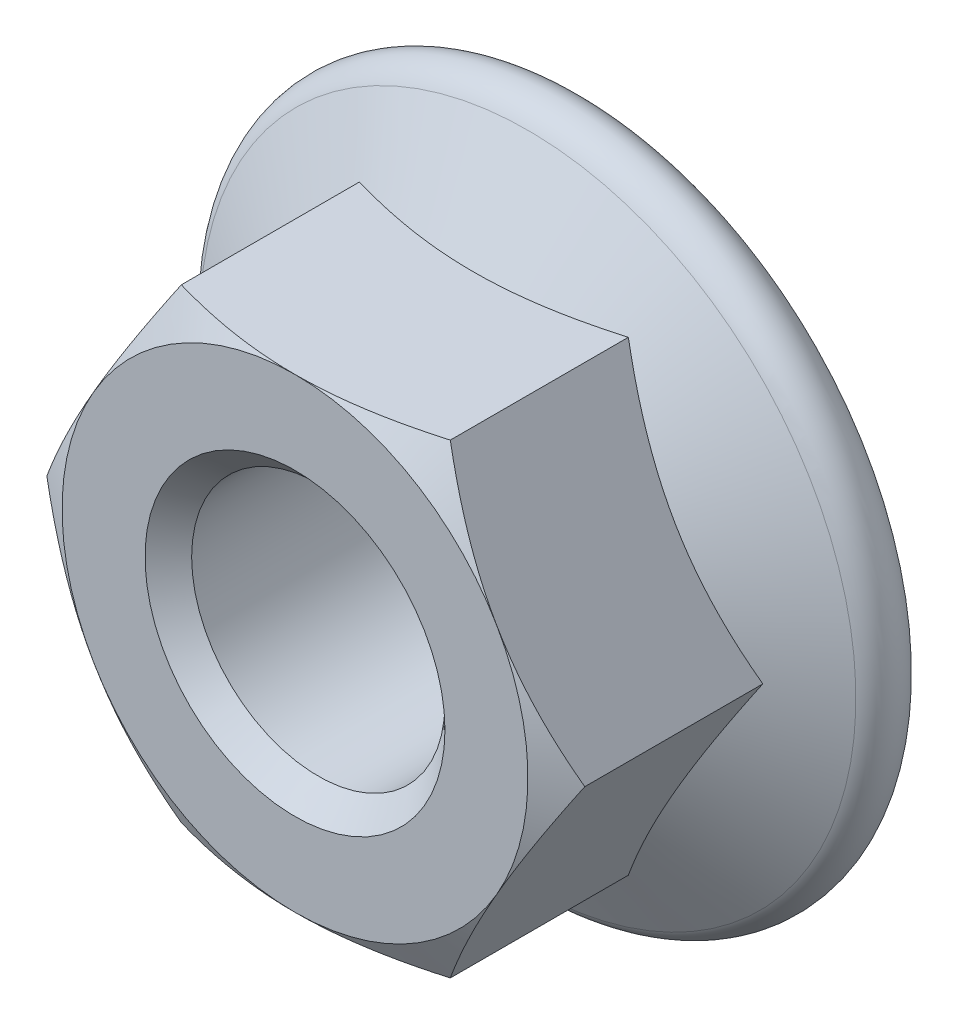
ISO-10303-21;
HEADER;
FILE_DESCRIPTION(('STEP AP214'),'2;1');
FILE_NAME('part.step','',(''),(''),'','','');
FILE_SCHEMA(('AUTOMOTIVE_DESIGN { 1 0 10303 214 1 1 1 1 }'));
ENDSEC;
DATA;
#1=APPLICATION_CONTEXT('core data for automotive mechanical design processes');
#2=APPLICATION_PROTOCOL_DEFINITION('international standard','automotive_design',2000,#1);
#3=PRODUCT_CONTEXT('',#1,'mechanical');
#4=PRODUCT('Part','Part','',(#3));
#5=PRODUCT_RELATED_PRODUCT_CATEGORY('part','',(#4));
#6=PRODUCT_DEFINITION_FORMATION('','',#4);
#7=PRODUCT_DEFINITION_CONTEXT('part definition',#1,'design');
#8=PRODUCT_DEFINITION('design','',#6,#7);
#9=PRODUCT_DEFINITION_SHAPE('','',#8);
#10=(LENGTH_UNIT() NAMED_UNIT(*) SI_UNIT(.MILLI.,.METRE.));
#11=(NAMED_UNIT(*) PLANE_ANGLE_UNIT() SI_UNIT($,.RADIAN.));
#12=(NAMED_UNIT(*) SI_UNIT($,.STERADIAN.) SOLID_ANGLE_UNIT());
#13=UNCERTAINTY_MEASURE_WITH_UNIT(LENGTH_MEASURE(1.E-05),#10,'distance_accuracy_value','');
#14=(GEOMETRIC_REPRESENTATION_CONTEXT(3) GLOBAL_UNCERTAINTY_ASSIGNED_CONTEXT((#13)) GLOBAL_UNIT_ASSIGNED_CONTEXT((#10,
#11,#12)) REPRESENTATION_CONTEXT('',''));
#15=CARTESIAN_POINT('',(0.,0.,0.));
#16=DIRECTION('',(0.,0.,1.));
#17=DIRECTION('',(1.,0.,0.));
#18=AXIS2_PLACEMENT_3D('',#15,#16,#17);
#19=CARTESIAN_POINT('',(116.671101853884,124.002196091981,109.));
#20=DIRECTION('',(0.,1.,0.));
#21=DIRECTION('',(0.,0.,1.));
#22=AXIS2_PLACEMENT_3D('',#19,#20,#21);
#23=PLANE('',#22);
#24=DIRECTION('',(0.,0.,-1.));
#25=VECTOR('',#24,1.);
#26=CARTESIAN_POINT('',(121.289904007401,124.002196091981,109.));
#27=LINE('',#26,#25);
#28=CARTESIAN_POINT('',(121.289904007401,124.002196091981,108.642734410092));
#29=VERTEX_POINT('',#28);
#30=CARTESIAN_POINT('',(121.289904007401,124.002196091981,105.584999383173));
#31=VERTEX_POINT('',#30);
#32=EDGE_CURVE('E105',#29,#31,#27,.T.);
#33=ORIENTED_EDGE('',*,*,#32,.T.);
#34=CARTESIAN_POINT('',(112.854569932878,124.002196091981,104.027645252341));
#35=CARTESIAN_POINT('',(113.028670295621,124.002196091981,104.111785230788));
#36=CARTESIAN_POINT('',(113.203178806788,124.002196091981,104.195095587076));
#37=CARTESIAN_POINT('',(113.553229544408,124.002196091981,104.359588717708));
#38=CARTESIAN_POINT('',(113.728771935977,124.002196091981,104.44077114027));
#39=CARTESIAN_POINT('',(114.082049776097,124.002196091981,104.600965101633));
#40=CARTESIAN_POINT('',(114.259792016124,124.002196091981,104.679961716444));
#41=CARTESIAN_POINT('',(114.616717949049,124.002196091981,104.834615947566));
#42=CARTESIAN_POINT('',(114.795901570879,124.002196091981,104.910273727319));
#43=CARTESIAN_POINT('',(115.161413375354,124.002196091981,105.059579129526));
#44=CARTESIAN_POINT('',(115.347794441612,124.002196091981,105.133098014597));
#45=CARTESIAN_POINT('',(115.722765359151,124.002196091981,105.274381754449));
#46=CARTESIAN_POINT('',(115.911355459512,124.002196091981,105.342145953117));
#47=CARTESIAN_POINT('',(116.290665881613,124.002196091981,105.470084829875));
#48=CARTESIAN_POINT('',(116.481380734726,124.002196091981,105.530275554097));
#49=CARTESIAN_POINT('',(116.865543999829,124.002196091981,105.641085533249));
#50=CARTESIAN_POINT('',(117.058991505555,124.002196091981,105.691707884917));
#51=CARTESIAN_POINT('',(117.447702345269,124.002196091981,105.78064451622));
#52=CARTESIAN_POINT('',(117.642951251657,124.002196091981,105.819020670594));
#53=CARTESIAN_POINT('',(118.035793074111,124.002196091981,105.881231941615));
#54=CARTESIAN_POINT('',(118.233385784783,124.002196091981,105.905068322957));
#55=CARTESIAN_POINT('',(118.627379808175,124.002196091981,105.935985315287));
#56=CARTESIAN_POINT('',(118.823764276613,124.002196091981,105.943275323691));
#57=CARTESIAN_POINT('',(119.216451654098,124.002196091981,105.941028226016));
#58=CARTESIAN_POINT('',(119.412754559926,124.002196091981,105.93149050934));
#59=CARTESIAN_POINT('',(119.748319206937,124.002196091981,105.901466050544));
#60=CARTESIAN_POINT('',(119.887947327311,124.002196091981,105.884858197205));
#61=CARTESIAN_POINT('',(120.166124240515,124.002196091981,105.844205230544));
#62=CARTESIAN_POINT('',(120.304672874304,124.002196091981,105.820159041801));
#63=CARTESIAN_POINT('',(120.718544005064,124.002196091981,105.738133045977));
#64=CARTESIAN_POINT('',(120.991928862072,124.002196091981,105.670282256499));
#65=CARTESIAN_POINT('',(121.400710224046,124.002196091981,105.553334559506));
#66=CARTESIAN_POINT('',(121.538241296952,124.002196091981,105.51128039321));
#67=CARTESIAN_POINT('',(121.81196591626,124.002196091981,105.422985620449));
#68=CARTESIAN_POINT('',(121.948159453563,124.002196091981,105.376744985525));
#69=CARTESIAN_POINT('',(122.219256711274,124.002196091981,105.2808043371));
#70=CARTESIAN_POINT('',(122.354160874402,124.002196091981,105.231105563357));
#71=CARTESIAN_POINT('',(122.622862718726,124.002196091981,105.128815301167));
#72=CARTESIAN_POINT('',(122.756660415051,124.002196091981,105.076223852345));
#73=CARTESIAN_POINT('',(123.082306374431,124.002196091981,104.944812731859));
#74=CARTESIAN_POINT('',(123.273627984409,124.002196091981,104.864690058126));
#75=CARTESIAN_POINT('',(123.654601117888,124.002196091981,104.700556506947));
#76=CARTESIAN_POINT('',(123.844252528889,124.002196091981,104.616545369933));
#77=CARTESIAN_POINT('',(124.222212218938,124.002196091981,104.445453979368));
#78=CARTESIAN_POINT('',(124.410520194685,124.002196091981,104.358373057585));
#79=CARTESIAN_POINT('',(124.785994503332,124.002196091981,104.181780053319));
#80=CARTESIAN_POINT('',(124.973160811041,124.002196091981,104.092267917425));
#81=CARTESIAN_POINT('',(125.533667395663,124.002196091981,103.820622470022));
#82=CARTESIAN_POINT('',(125.905593665019,124.002196091981,103.635573768498));
#83=CARTESIAN_POINT('',(126.646766116417,124.002196091981,103.260337429181));
#84=CARTESIAN_POINT('',(127.016012641722,124.002196091981,103.070150464859));
#85=CARTESIAN_POINT('',(127.720139106845,124.002196091981,102.703078877873));
#86=CARTESIAN_POINT('',(128.055178657492,124.002196091981,102.526499883192));
#87=CARTESIAN_POINT('',(128.724076813033,124.002196091981,102.17109182806));
#88=CARTESIAN_POINT('',(129.057935371963,124.002196091981,101.992262681241));
#89=CARTESIAN_POINT('',(129.723888929967,124.002196091981,101.633356362133));
#90=CARTESIAN_POINT('',(130.055986254079,124.002196091981,101.453283498695));
#91=CARTESIAN_POINT('',(130.719432454581,124.002196091981,101.091808101388));
#92=CARTESIAN_POINT('',(131.05078137217,124.002196091981,100.910405643166));
#93=CARTESIAN_POINT('',(131.381857785287,124.002196091981,100.72851063404));
#94=B_SPLINE_CURVE_WITH_KNOTS('',3,(#34,#35,#36,#37,#38,#39,#40,#41,#42,#43,#44,#45,#46,#47,#48,
#49,#50,#51,#52,#53,#54,#55,#56,#57,#58,#59,#60,#61,#62,#63,#64,#65,#66,#67,#68,#69,#70,#71,#72,
#73,#74,#75,#76,#77,#78,#79,#80,#81,#82,#83,#84,#85,#86,#87,#88,#89,#90,#91,#92,#93),
.UNSPECIFIED.,.F.,.F.,(4,2,2,2,2,2,2,2,2,2,2,2,2,2,2,2,2,2,2,2,2,2,2,2,2,2,2,2,2,4),(0.,
0.580105967146605,1.16030723812042,1.74379921729656,2.32726260193295,2.92826021724387,
3.52932626266778,4.12909656482218,4.72867242187309,5.32516906985851,5.92161382615311,
6.51046734710153,7.09934223513768,7.52097336353687,7.94266547917407,8.7865385967925,
9.21795564245651,9.64937562087386,10.0806417223477,10.5119019176761,11.134106170094,
11.7563520167808,12.3787341607446,13.0011299889885,14.2473133572912,15.4933341741928,
16.6294938464963,17.7656972617079,18.8990225578083,20.0322838661054),.UNSPECIFIED.);
#95=CARTESIAN_POINT('',(116.671101853884,124.002196091981,105.584999383173));
#96=VERTEX_POINT('',#95);
#97=EDGE_CURVE('E89',#31,#96,#94,.F.);
#98=ORIENTED_EDGE('',*,*,#97,.T.);
#99=DIRECTION('',(0.,0.,-1.));
#100=VECTOR('',#99,1.);
#101=CARTESIAN_POINT('',(116.671101853884,124.002196091981,109.));
#102=LINE('',#101,#100);
#103=CARTESIAN_POINT('',(116.671101853884,124.002196091981,108.642734410092));
#104=VERTEX_POINT('',#103);
#105=EDGE_CURVE('E102',#104,#96,#102,.T.);
#106=ORIENTED_EDGE('',*,*,#105,.F.);
#107=CARTESIAN_POINT('',(112.744332002029,124.002196091981,107.03194747869));
#108=CARTESIAN_POINT('',(112.919372940089,124.002196091981,107.116989552009));
#109=CARTESIAN_POINT('',(113.09481230546,124.002196091981,107.201225429848));
#110=CARTESIAN_POINT('',(113.446699758567,124.002196091981,107.367631826773));
#111=CARTESIAN_POINT('',(113.623147997298,124.002196091981,107.449802026211));
#112=CARTESIAN_POINT('',(113.978157818879,124.002196091981,107.612030165374));
#113=CARTESIAN_POINT('',(114.156725656919,124.002196091981,107.692074463338));
#114=CARTESIAN_POINT('',(114.515270821508,124.002196091981,107.848929178528));
#115=CARTESIAN_POINT('',(114.695248081811,124.002196091981,107.925739746677));
#116=CARTESIAN_POINT('',(115.062715129453,124.002196091981,108.077679032264));
#117=CARTESIAN_POINT('',(115.250260406828,124.002196091981,108.152674270128));
#118=CARTESIAN_POINT('',(115.627532621469,124.002196091981,108.297067878412));
#119=CARTESIAN_POINT('',(115.817259798877,124.002196091981,108.3664656259));
#120=CARTESIAN_POINT('',(116.198853609428,124.002196091981,108.497867360485));
#121=CARTESIAN_POINT('',(116.390715145105,124.002196091981,108.559886003728));
#122=CARTESIAN_POINT('',(116.777189615399,124.002196091981,108.674561711557));
#123=CARTESIAN_POINT('',(116.971801673979,124.002196091981,108.727221687423));
#124=CARTESIAN_POINT('',(117.362860739232,124.002196091981,108.820408167018));
#125=CARTESIAN_POINT('',(117.559292346354,124.002196091981,108.860998113875));
#126=CARTESIAN_POINT('',(117.95463123238,124.002196091981,108.927751877519));
#127=CARTESIAN_POINT('',(118.153538246257,124.002196091981,108.953917225317));
#128=CARTESIAN_POINT('',(118.550223715742,124.002196091981,108.989393720221));
#129=CARTESIAN_POINT('',(118.747982066445,124.002196091981,108.998924128112));
#130=CARTESIAN_POINT('',(119.143605068304,124.002196091981,109.000901985867));
#131=CARTESIAN_POINT('',(119.341469722713,124.002196091981,108.993348879088));
#132=CARTESIAN_POINT('',(119.67632087156,124.002196091981,108.966647938879));
#133=CARTESIAN_POINT('',(119.81366221538,124.002196091981,108.951686258671));
#134=CARTESIAN_POINT('',(120.087355743056,124.002196091981,108.914444823405));
#135=CARTESIAN_POINT('',(120.223707794711,124.002196091981,108.892164108058));
#136=CARTESIAN_POINT('',(120.631080396758,124.002196091981,108.815513146701));
#137=CARTESIAN_POINT('',(120.900279088005,124.002196091981,108.751346591712));
#138=CARTESIAN_POINT('',(121.303039656072,124.002196091981,108.639829230765));
#139=CARTESIAN_POINT('',(121.438679573053,124.002196091981,108.599554903281));
#140=CARTESIAN_POINT('',(121.708641229049,124.002196091981,108.514768387074));
#141=CARTESIAN_POINT('',(121.842962957571,124.002196091981,108.470256164648));
#142=CARTESIAN_POINT('',(122.110333142538,124.002196091981,108.377712937832));
#143=CARTESIAN_POINT('',(122.243381963081,124.002196091981,108.329682975866));
#144=CARTESIAN_POINT('',(122.508370417183,124.002196091981,108.230674980172));
#145=CARTESIAN_POINT('',(122.640310080666,124.002196091981,108.179697026272));
#146=CARTESIAN_POINT('',(123.014291705351,124.002196091981,108.031171990599));
#147=CARTESIAN_POINT('',(123.255160836971,124.002196091981,107.930673898552));
#148=CARTESIAN_POINT('',(123.734293857578,124.002196091981,107.723625680052));
#149=CARTESIAN_POINT('',(123.972557404172,124.002196091981,107.617074769343));
#150=CARTESIAN_POINT('',(124.447127597305,124.002196091981,107.399447696146));
#151=CARTESIAN_POINT('',(124.683433343807,124.002196091981,107.288369577758));
#152=CARTESIAN_POINT('',(125.154409492305,124.002196091981,107.062840090155));
#153=CARTESIAN_POINT('',(125.389079973455,124.002196091981,106.948388885636));
#154=CARTESIAN_POINT('',(125.857541023468,124.002196091981,106.716688354032));
#155=CARTESIAN_POINT('',(126.091329351251,124.002196091981,106.59943450537));
#156=CARTESIAN_POINT('',(126.557870998159,124.002196091981,106.362883517059));
#157=CARTESIAN_POINT('',(126.790624306773,124.002196091981,106.243586356721));
#158=CARTESIAN_POINT('',(127.487519576127,124.002196091981,105.883345960568));
#159=CARTESIAN_POINT('',(127.950415903306,124.002196091981,105.639994355233));
#160=CARTESIAN_POINT('',(128.821123220575,124.002196091981,105.177174281006));
#161=CARTESIAN_POINT('',(129.22917642717,124.002196091981,104.958159321678));
#162=CARTESIAN_POINT('',(130.044016938461,124.002196091981,104.517719054942));
#163=CARTESIAN_POINT('',(130.450804150931,124.002196091981,104.29629357698));
#164=CARTESIAN_POINT('',(131.261989589027,124.002196091981,103.852454124858));
#165=CARTESIAN_POINT('',(131.666391193919,124.002196091981,103.630046317593));
#166=CARTESIAN_POINT('',(132.4744076827,124.002196091981,103.183887785711));
#167=CARTESIAN_POINT('',(132.878022631464,124.002196091981,102.960137178634));
#168=CARTESIAN_POINT('',(133.281366269009,124.002196091981,102.735901359167));
#169=B_SPLINE_CURVE_WITH_KNOTS('',3,(#107,#108,#109,#110,#111,#112,#113,#114,#115,#116,#117,
#118,#119,#120,#121,#122,#123,#124,#125,#126,#127,#128,#129,#130,#131,#132,#133,#134,#135,#136,
#137,#138,#139,#140,#141,#142,#143,#144,#145,#146,#147,#148,#149,#150,#151,#152,#153,#154,#155,
#156,#157,#158,#159,#160,#161,#162,#163,#164,#165,#166,#167,#168),.UNSPECIFIED.,.F.,.F.,(4,2,2,
2,2,2,2,2,2,2,2,2,2,2,2,2,2,2,2,2,2,2,2,2,2,2,2,2,2,2,4),(0.,0.583824901486328,1.16773959630481,
1.75477613722881,2.34178524980504,2.94766803009382,3.55361814489943,4.15834390654722,
4.76288122048036,5.36418236246308,5.96541967072356,6.55867063215254,7.15194092410998,
7.56620252172204,7.98051849399418,8.80956515672429,9.23400657522244,9.65845136947785,
10.0827708916112,10.5070789290598,11.2899312161693,12.0728851687987,12.8561810448207,
13.6394387383186,14.4240590899562,15.2086873911361,16.7775448955027,18.1668801950531,
19.556314443557,20.9408885757902,22.3253432306253),.UNSPECIFIED.);
#170=CARTESIAN_POINT('',(118.980502930643,124.002196091981,109.));
#171=VERTEX_POINT('',#170);
#172=EDGE_CURVE('E161',#171,#104,#169,.F.);
#173=ORIENTED_EDGE('',*,*,#172,.F.);
#174=EDGE_CURVE('E239',#29,#171,#169,.F.);
#175=ORIENTED_EDGE('',*,*,#174,.F.);
#176=EDGE_LOOP('',(#33,#98,#106,#173,#175));
#177=FACE_BOUND('',#176,.T.);
#178=ADVANCED_FACE('F17',(#177),#23,.T.);
#179=CARTESIAN_POINT('',(121.289904007401,124.002196091981,109.));
#180=DIRECTION('',(0.866025403784439,0.5,0.));
#181=DIRECTION('',(-0.5,0.866025403784439,0.));
#182=AXIS2_PLACEMENT_3D('',#179,#180,#181);
#183=PLANE('',#182);
#184=DIRECTION('',(0.,0.,-1.));
#185=VECTOR('',#184,1.);
#186=CARTESIAN_POINT('',(123.59930508416,120.002196091981,109.));
#187=LINE('',#186,#185);
#188=CARTESIAN_POINT('',(123.59930508416,120.002196091981,108.642734410092));
#189=VERTEX_POINT('',#188);
#190=CARTESIAN_POINT('',(123.59930508416,120.002196091981,105.584999383173));
#191=VERTEX_POINT('',#190);
#192=EDGE_CURVE('E236',#189,#191,#187,.T.);
#193=ORIENTED_EDGE('',*,*,#192,.T.);
#194=CARTESIAN_POINT('',(123.599420554214,120.001996091981,105.584932714006));
#195=CARTESIAN_POINT('',(123.497934414457,120.177775242304,105.643547099433));
#196=CARTESIAN_POINT('',(123.395572252083,120.355071708307,105.696854651619));
#197=CARTESIAN_POINT('',(123.18907543612,120.712734685156,105.789903302335));
#198=CARTESIAN_POINT('',(123.084937113499,120.893107550951,105.829611484051));
#199=CARTESIAN_POINT('',(122.8779510608,121.251617910683,105.891422757801));
#200=CARTESIAN_POINT('',(122.775135177193,121.429700244916,105.913937241558));
#201=CARTESIAN_POINT('',(122.569019650633,121.786702809147,105.940814349934));
#202=CARTESIAN_POINT('',(122.465720756804,121.965621741625,105.945199231654));
#203=CARTESIAN_POINT('',(122.272702635689,122.299938934177,105.936074900141));
#204=CARTESIAN_POINT('',(122.182954507568,122.455387251968,105.924806019093));
#205=CARTESIAN_POINT('',(122.004042956998,122.765271147616,105.889090982283));
#206=CARTESIAN_POINT('',(121.914880153324,122.919705653725,105.86463262737));
#207=CARTESIAN_POINT('',(121.735599750766,123.230228419755,105.803488908162));
#208=CARTESIAN_POINT('',(121.645504841537,123.386277380044,105.766544369426));
#209=CARTESIAN_POINT('',(121.466658732643,123.696047927384,105.682694900533));
#210=CARTESIAN_POINT('',(121.377905241869,123.849773482754,105.635809670868));
#211=CARTESIAN_POINT('',(121.289788537348,124.002396091981,105.584932714006));
#212=B_SPLINE_CURVE_WITH_KNOTS('',3,(#194,#195,#196,#197,#198,#199,#200,#201,#202,#203,#204,
#205,#206,#207,#208,#209,#210,#211),.UNSPECIFIED.,.F.,.F.,(4,2,2,2,2,2,2,2,4),(0.,
0.634047835695967,1.26961969224542,1.8894615721312,2.50854226669297,3.04757825393388,
3.58711366126907,4.13861653143768,4.68903648037747),.UNSPECIFIED.);
#213=EDGE_CURVE('E107',#191,#31,#212,.T.);
#214=ORIENTED_EDGE('',*,*,#213,.T.);
#215=ORIENTED_EDGE('',*,*,#32,.F.);
#216=CARTESIAN_POINT('',(123.599420554214,120.001996091981,108.642667740925));
#217=CARTESIAN_POINT('',(123.497934414457,120.177775242304,108.701282126352));
#218=CARTESIAN_POINT('',(123.395572252083,120.355071708307,108.754589678538));
#219=CARTESIAN_POINT('',(123.18907543612,120.712734685156,108.847638329254));
#220=CARTESIAN_POINT('',(123.084937113499,120.893107550951,108.88734651097));
#221=CARTESIAN_POINT('',(122.8779510608,121.251617910683,108.94915778472));
#222=CARTESIAN_POINT('',(122.775135177193,121.429700244916,108.971672268477));
#223=CARTESIAN_POINT('',(122.569019650633,121.786702809147,108.998549376853));
#224=CARTESIAN_POINT('',(122.465720756804,121.965621741625,109.002934258573));
#225=CARTESIAN_POINT('',(122.272702635689,122.299938934177,108.99380992706));
#226=CARTESIAN_POINT('',(122.182954507568,122.455387251968,108.982541046012));
#227=CARTESIAN_POINT('',(122.004042956998,122.765271147616,108.946826009202));
#228=CARTESIAN_POINT('',(121.914880153324,122.919705653725,108.922367654289));
#229=CARTESIAN_POINT('',(121.735599750766,123.230228419755,108.861223935081));
#230=CARTESIAN_POINT('',(121.645504841537,123.386277380044,108.824279396345));
#231=CARTESIAN_POINT('',(121.466658732643,123.696047927384,108.740429927452));
#232=CARTESIAN_POINT('',(121.377905241869,123.849773482754,108.693544697787));
#233=CARTESIAN_POINT('',(121.289788537348,124.002396091981,108.642667740925));
#234=B_SPLINE_CURVE_WITH_KNOTS('',3,(#216,#217,#218,#219,#220,#221,#222,#223,#224,#225,#226,
#227,#228,#229,#230,#231,#232,#233),.UNSPECIFIED.,.F.,.F.,(4,2,2,2,2,2,2,2,4),(0.,
0.634047835695971,1.2696196922454,1.88946157213121,2.50854226669297,3.04757825393388,
3.58711366126907,4.13861653143768,4.68903648037748),.UNSPECIFIED.);
#235=CARTESIAN_POINT('',(122.444604545781,122.002196091981,109.));
#236=VERTEX_POINT('',#235);
#237=EDGE_CURVE('E173',#236,#29,#234,.T.);
#238=ORIENTED_EDGE('',*,*,#237,.F.);
#239=EDGE_CURVE('E178',#189,#236,#234,.T.);
#240=ORIENTED_EDGE('',*,*,#239,.F.);
#241=EDGE_LOOP('',(#193,#214,#215,#238,#240));
#242=FACE_BOUND('',#241,.T.);
#243=ADVANCED_FACE('F183',(#242),#183,.T.);
#244=CARTESIAN_POINT('',(123.59930508416,120.002196091981,109.));
#245=DIRECTION('',(0.866025403784438,-0.5,0.));
#246=DIRECTION('',(0.5,0.866025403784438,0.));
#247=AXIS2_PLACEMENT_3D('',#244,#245,#246);
#248=PLANE('',#247);
#249=DIRECTION('',(0.,0.,-1.));
#250=VECTOR('',#249,1.);
#251=CARTESIAN_POINT('',(121.289904007401,116.002196091981,109.));
#252=LINE('',#251,#250);
#253=CARTESIAN_POINT('',(121.289904007401,116.002196091981,108.642734410092));
#254=VERTEX_POINT('',#253);
#255=CARTESIAN_POINT('',(121.289904007401,116.002196091981,105.584999383173));
#256=VERTEX_POINT('',#255);
#257=EDGE_CURVE('E410',#254,#256,#252,.T.);
#258=ORIENTED_EDGE('',*,*,#257,.T.);
#259=CARTESIAN_POINT('',(121.289788537348,116.001996091981,105.584932714006));
#260=CARTESIAN_POINT('',(121.391274677105,116.177775242304,105.643547099433));
#261=CARTESIAN_POINT('',(121.493636839478,116.355071708307,105.696854651619));
#262=CARTESIAN_POINT('',(121.700133655441,116.712734685156,105.789903302335));
#263=CARTESIAN_POINT('',(121.804271978062,116.893107550951,105.829611484051));
#264=CARTESIAN_POINT('',(122.011258030761,117.251617910683,105.891422757801));
#265=CARTESIAN_POINT('',(122.114073914368,117.429700244916,105.913937241558));
#266=CARTESIAN_POINT('',(122.320189440928,117.786702809147,105.940814349934));
#267=CARTESIAN_POINT('',(122.423488334757,117.965621741625,105.945199231654));
#268=CARTESIAN_POINT('',(122.616506455872,118.299938934177,105.936074900141));
#269=CARTESIAN_POINT('',(122.706254583994,118.455387251968,105.924806019093));
#270=CARTESIAN_POINT('',(122.885166134564,118.765271147616,105.889090982283));
#271=CARTESIAN_POINT('',(122.974328938238,118.919705653725,105.864632627369));
#272=CARTESIAN_POINT('',(123.153609340795,119.230228419755,105.803488908162));
#273=CARTESIAN_POINT('',(123.243704250024,119.386277380044,105.766544369426));
#274=CARTESIAN_POINT('',(123.422550358918,119.696047927384,105.682694900533));
#275=CARTESIAN_POINT('',(123.511303849693,119.849773482754,105.635809670868));
#276=CARTESIAN_POINT('',(123.599420554214,120.002396091981,105.584932714006));
#277=B_SPLINE_CURVE_WITH_KNOTS('',3,(#259,#260,#261,#262,#263,#264,#265,#266,#267,#268,#269,
#270,#271,#272,#273,#274,#275,#276),.UNSPECIFIED.,.F.,.F.,(4,2,2,2,2,2,2,2,4),(0.,
0.634047835696002,1.26961969224548,1.8894615721313,2.50854226669307,3.04757825393394,
3.58711366126911,4.13861653143769,4.68903648037745),.UNSPECIFIED.);
#278=EDGE_CURVE('E196',#256,#191,#277,.T.);
#279=ORIENTED_EDGE('',*,*,#278,.T.);
#280=ORIENTED_EDGE('',*,*,#192,.F.);
#281=CARTESIAN_POINT('',(121.289788537348,116.001996091981,108.642667740925));
#282=CARTESIAN_POINT('',(121.391274677105,116.177775242304,108.701282126352));
#283=CARTESIAN_POINT('',(121.493636839478,116.355071708307,108.754589678538));
#284=CARTESIAN_POINT('',(121.700133655441,116.712734685156,108.847638329254));
#285=CARTESIAN_POINT('',(121.804271978062,116.893107550951,108.88734651097));
#286=CARTESIAN_POINT('',(122.011258030761,117.251617910683,108.94915778472));
#287=CARTESIAN_POINT('',(122.114073914368,117.429700244916,108.971672268477));
#288=CARTESIAN_POINT('',(122.320189440928,117.786702809147,108.998549376853));
#289=CARTESIAN_POINT('',(122.423488334757,117.965621741625,109.002934258573));
#290=CARTESIAN_POINT('',(122.616506455872,118.299938934177,108.99380992706));
#291=CARTESIAN_POINT('',(122.706254583994,118.455387251968,108.982541046012));
#292=CARTESIAN_POINT('',(122.885166134564,118.765271147616,108.946826009202));
#293=CARTESIAN_POINT('',(122.974328938238,118.919705653725,108.922367654288));
#294=CARTESIAN_POINT('',(123.153609340795,119.230228419755,108.861223935081));
#295=CARTESIAN_POINT('',(123.243704250024,119.386277380044,108.824279396345));
#296=CARTESIAN_POINT('',(123.422550358918,119.696047927384,108.740429927452));
#297=CARTESIAN_POINT('',(123.511303849693,119.849773482754,108.693544697787));
#298=CARTESIAN_POINT('',(123.599420554214,120.002396091981,108.642667740925));
#299=B_SPLINE_CURVE_WITH_KNOTS('',3,(#281,#282,#283,#284,#285,#286,#287,#288,#289,#290,#291,
#292,#293,#294,#295,#296,#297,#298),.UNSPECIFIED.,.F.,.F.,(4,2,2,2,2,2,2,2,4),(0.,
0.634047835695994,1.26961969224548,1.88946157213129,2.50854226669307,3.04757825393395,
3.58711366126911,4.13861653143768,4.68903648037746),.UNSPECIFIED.);
#300=CARTESIAN_POINT('',(122.444604545781,118.002196091981,109.));
#301=VERTEX_POINT('',#300);
#302=EDGE_CURVE('E118',#301,#189,#299,.T.);
#303=ORIENTED_EDGE('',*,*,#302,.F.);
#304=EDGE_CURVE('E113',#254,#301,#299,.T.);
#305=ORIENTED_EDGE('',*,*,#304,.F.);
#306=EDGE_LOOP('',(#258,#279,#280,#303,#305));
#307=FACE_BOUND('',#306,.T.);
#308=ADVANCED_FACE('F186',(#307),#248,.T.);
#309=CARTESIAN_POINT('',(121.289904007401,116.002196091981,109.));
#310=DIRECTION('',(0.,-1.,0.));
#311=DIRECTION('',(0.,0.,-1.));
#312=AXIS2_PLACEMENT_3D('',#309,#310,#311);
#313=PLANE('',#312);
#314=DIRECTION('',(0.,0.,-1.));
#315=VECTOR('',#314,1.);
#316=CARTESIAN_POINT('',(116.671101853884,116.002196091981,109.));
#317=LINE('',#316,#315);
#318=CARTESIAN_POINT('',(116.671101853884,116.002196091981,108.642734410092));
#319=VERTEX_POINT('',#318);
#320=CARTESIAN_POINT('',(116.671101853884,116.002196091981,105.584999383173));
#321=VERTEX_POINT('',#320);
#322=EDGE_CURVE('E115',#319,#321,#317,.T.);
#323=ORIENTED_EDGE('',*,*,#322,.T.);
#324=CARTESIAN_POINT('',(112.854569932878,116.002196091981,104.027645252341));
#325=CARTESIAN_POINT('',(113.028670295621,116.002196091981,104.111785230788));
#326=CARTESIAN_POINT('',(113.203178806788,116.002196091981,104.195095587076));
#327=CARTESIAN_POINT('',(113.553229544408,116.002196091981,104.359588717708));
#328=CARTESIAN_POINT('',(113.728771935977,116.002196091981,104.44077114027));
#329=CARTESIAN_POINT('',(114.082049776097,116.002196091981,104.600965101633));
#330=CARTESIAN_POINT('',(114.259792016124,116.002196091981,104.679961716444));
#331=CARTESIAN_POINT('',(114.616717949049,116.002196091981,104.834615947566));
#332=CARTESIAN_POINT('',(114.795901570879,116.002196091981,104.910273727319));
#333=CARTESIAN_POINT('',(115.161413375354,116.002196091981,105.059579129526));
#334=CARTESIAN_POINT('',(115.347794441612,116.002196091981,105.133098014597));
#335=CARTESIAN_POINT('',(115.722765359151,116.002196091981,105.274381754449));
#336=CARTESIAN_POINT('',(115.911355459512,116.002196091981,105.342145953117));
#337=CARTESIAN_POINT('',(116.290665881613,116.002196091981,105.470084829875));
#338=CARTESIAN_POINT('',(116.481380734726,116.002196091981,105.530275554097));
#339=CARTESIAN_POINT('',(116.865543999829,116.002196091981,105.641085533249));
#340=CARTESIAN_POINT('',(117.058991505555,116.002196091981,105.691707884917));
#341=CARTESIAN_POINT('',(117.447702345269,116.002196091981,105.78064451622));
#342=CARTESIAN_POINT('',(117.642951251657,116.002196091981,105.819020670594));
#343=CARTESIAN_POINT('',(118.035793074111,116.002196091981,105.881231941615));
#344=CARTESIAN_POINT('',(118.233385784783,116.002196091981,105.905068322957));
#345=CARTESIAN_POINT('',(118.627379808175,116.002196091981,105.935985315287));
#346=CARTESIAN_POINT('',(118.823764276613,116.002196091981,105.943275323691));
#347=CARTESIAN_POINT('',(119.216451654098,116.002196091981,105.941028226016));
#348=CARTESIAN_POINT('',(119.412754559926,116.002196091981,105.93149050934));
#349=CARTESIAN_POINT('',(119.748319206937,116.002196091981,105.901466050544));
#350=CARTESIAN_POINT('',(119.887947327311,116.002196091981,105.884858197205));
#351=CARTESIAN_POINT('',(120.166124240515,116.002196091981,105.844205230544));
#352=CARTESIAN_POINT('',(120.304672874304,116.002196091981,105.820159041801));
#353=CARTESIAN_POINT('',(120.718544005064,116.002196091981,105.738133045977));
#354=CARTESIAN_POINT('',(120.991928862072,116.002196091981,105.670282256499));
#355=CARTESIAN_POINT('',(121.400710224046,116.002196091981,105.553334559506));
#356=CARTESIAN_POINT('',(121.538241296952,116.002196091981,105.51128039321));
#357=CARTESIAN_POINT('',(121.81196591626,116.002196091981,105.422985620449));
#358=CARTESIAN_POINT('',(121.948159453563,116.002196091981,105.376744985525));
#359=CARTESIAN_POINT('',(122.219256711274,116.002196091981,105.2808043371));
#360=CARTESIAN_POINT('',(122.354160874402,116.002196091981,105.231105563357));
#361=CARTESIAN_POINT('',(122.622862718726,116.002196091981,105.128815301167));
#362=CARTESIAN_POINT('',(122.756660415051,116.002196091981,105.076223852345));
#363=CARTESIAN_POINT('',(123.082306374431,116.002196091981,104.944812731859));
#364=CARTESIAN_POINT('',(123.273627984409,116.002196091981,104.864690058126));
#365=CARTESIAN_POINT('',(123.654601117888,116.002196091981,104.700556506947));
#366=CARTESIAN_POINT('',(123.844252528889,116.002196091981,104.616545369933));
#367=CARTESIAN_POINT('',(124.222212218938,116.002196091981,104.445453979368));
#368=CARTESIAN_POINT('',(124.410520194685,116.002196091981,104.358373057585));
#369=CARTESIAN_POINT('',(124.785994503332,116.002196091981,104.181780053319));
#370=CARTESIAN_POINT('',(124.973160811041,116.002196091981,104.092267917425));
#371=CARTESIAN_POINT('',(125.533667395663,116.002196091981,103.820622470022));
#372=CARTESIAN_POINT('',(125.905593665019,116.002196091981,103.635573768498));
#373=CARTESIAN_POINT('',(126.646766116417,116.002196091981,103.260337429181));
#374=CARTESIAN_POINT('',(127.016012641722,116.002196091981,103.070150464859));
#375=CARTESIAN_POINT('',(127.720139106845,116.002196091981,102.703078877873));
#376=CARTESIAN_POINT('',(128.055178657492,116.002196091981,102.526499883192));
#377=CARTESIAN_POINT('',(128.724076813033,116.002196091981,102.17109182806));
#378=CARTESIAN_POINT('',(129.057935371963,116.002196091981,101.992262681241));
#379=CARTESIAN_POINT('',(129.723888929967,116.002196091981,101.633356362133));
#380=CARTESIAN_POINT('',(130.055986254079,116.002196091981,101.453283498695));
#381=CARTESIAN_POINT('',(130.719432454581,116.002196091981,101.091808101388));
#382=CARTESIAN_POINT('',(131.05078137217,116.002196091981,100.910405643166));
#383=CARTESIAN_POINT('',(131.381857785287,116.002196091981,100.72851063404));
#384=B_SPLINE_CURVE_WITH_KNOTS('',3,(#324,#325,#326,#327,#328,#329,#330,#331,#332,#333,#334,
#335,#336,#337,#338,#339,#340,#341,#342,#343,#344,#345,#346,#347,#348,#349,#350,#351,#352,#353,
#354,#355,#356,#357,#358,#359,#360,#361,#362,#363,#364,#365,#366,#367,#368,#369,#370,#371,#372,
#373,#374,#375,#376,#377,#378,#379,#380,#381,#382,#383),.UNSPECIFIED.,.F.,.F.,(4,2,2,2,2,2,2,2,
2,2,2,2,2,2,2,2,2,2,2,2,2,2,2,2,2,2,2,2,2,4),(0.,0.580105967146605,1.16030723812042,
1.74379921729655,2.32726260193295,2.92826021724384,3.52932626266775,4.12909656482216,
4.72867242187309,5.32516906985851,5.92161382615311,6.51046734710155,7.09934223513768,
7.52097336353686,7.94266547917407,8.7865385967925,9.21795564245649,9.64937562087385,
10.0806417223477,10.5119019176761,11.134106170094,11.7563520167808,12.3787341607446,
13.0011299889885,14.2473133572912,15.4933341741928,16.6294938464963,17.7656972617079,
18.8990225578083,20.0322838661053),.UNSPECIFIED.);
#385=EDGE_CURVE('E400',#321,#256,#384,.T.);
#386=ORIENTED_EDGE('',*,*,#385,.T.);
#387=ORIENTED_EDGE('',*,*,#257,.F.);
#388=CARTESIAN_POINT('',(112.744332002029,116.002196091981,107.03194747869));
#389=CARTESIAN_POINT('',(112.919372940089,116.002196091981,107.116989552009));
#390=CARTESIAN_POINT('',(113.09481230546,116.002196091981,107.201225429848));
#391=CARTESIAN_POINT('',(113.446699758567,116.002196091981,107.367631826773));
#392=CARTESIAN_POINT('',(113.623147997298,116.002196091981,107.449802026211));
#393=CARTESIAN_POINT('',(113.978157818879,116.002196091981,107.612030165374));
#394=CARTESIAN_POINT('',(114.156725656919,116.002196091981,107.692074463338));
#395=CARTESIAN_POINT('',(114.515270821508,116.002196091981,107.848929178528));
#396=CARTESIAN_POINT('',(114.695248081811,116.002196091981,107.925739746677));
#397=CARTESIAN_POINT('',(115.062715129453,116.002196091981,108.077679032264));
#398=CARTESIAN_POINT('',(115.250260406828,116.002196091981,108.152674270128));
#399=CARTESIAN_POINT('',(115.627532621469,116.002196091981,108.297067878412));
#400=CARTESIAN_POINT('',(115.817259798877,116.002196091981,108.3664656259));
#401=CARTESIAN_POINT('',(116.198853609428,116.002196091981,108.497867360485));
#402=CARTESIAN_POINT('',(116.390715145105,116.002196091981,108.559886003728));
#403=CARTESIAN_POINT('',(116.777189615399,116.002196091981,108.674561711557));
#404=CARTESIAN_POINT('',(116.971801673979,116.002196091981,108.727221687423));
#405=CARTESIAN_POINT('',(117.362860739232,116.002196091981,108.820408167018));
#406=CARTESIAN_POINT('',(117.559292346354,116.002196091981,108.860998113875));
#407=CARTESIAN_POINT('',(117.95463123238,116.002196091981,108.927751877519));
#408=CARTESIAN_POINT('',(118.153538246257,116.002196091981,108.953917225317));
#409=CARTESIAN_POINT('',(118.550223715742,116.002196091981,108.989393720221));
#410=CARTESIAN_POINT('',(118.747982066445,116.002196091981,108.998924128112));
#411=CARTESIAN_POINT('',(119.143605068304,116.002196091981,109.000901985867));
#412=CARTESIAN_POINT('',(119.341469722713,116.002196091981,108.993348879088));
#413=CARTESIAN_POINT('',(119.67632087156,116.002196091981,108.966647938879));
#414=CARTESIAN_POINT('',(119.81366221538,116.002196091981,108.951686258671));
#415=CARTESIAN_POINT('',(120.087355743056,116.002196091981,108.914444823405));
#416=CARTESIAN_POINT('',(120.223707794711,116.002196091981,108.892164108057));
#417=CARTESIAN_POINT('',(120.631080396758,116.002196091981,108.815513146701));
#418=CARTESIAN_POINT('',(120.900279088005,116.002196091981,108.751346591712));
#419=CARTESIAN_POINT('',(121.303039656072,116.002196091981,108.639829230765));
#420=CARTESIAN_POINT('',(121.438679573053,116.002196091981,108.599554903281));
#421=CARTESIAN_POINT('',(121.708641229049,116.002196091981,108.514768387074));
#422=CARTESIAN_POINT('',(121.842962957571,116.002196091981,108.470256164648));
#423=CARTESIAN_POINT('',(122.110333142538,116.002196091981,108.377712937832));
#424=CARTESIAN_POINT('',(122.243381963081,116.002196091981,108.329682975866));
#425=CARTESIAN_POINT('',(122.508370417183,116.002196091981,108.230674980172));
#426=CARTESIAN_POINT('',(122.640310080666,116.002196091981,108.179697026272));
#427=CARTESIAN_POINT('',(123.014291705351,116.002196091981,108.031171990599));
#428=CARTESIAN_POINT('',(123.255160836971,116.002196091981,107.930673898552));
#429=CARTESIAN_POINT('',(123.734293857578,116.002196091981,107.723625680052));
#430=CARTESIAN_POINT('',(123.972557404172,116.002196091981,107.617074769343));
#431=CARTESIAN_POINT('',(124.447127597305,116.002196091981,107.399447696146));
#432=CARTESIAN_POINT('',(124.683433343807,116.002196091981,107.288369577758));
#433=CARTESIAN_POINT('',(125.154409492305,116.002196091981,107.062840090155));
#434=CARTESIAN_POINT('',(125.389079973455,116.002196091981,106.948388885636));
#435=CARTESIAN_POINT('',(125.857541023468,116.002196091981,106.716688354032));
#436=CARTESIAN_POINT('',(126.091329351251,116.002196091981,106.59943450537));
#437=CARTESIAN_POINT('',(126.557870998159,116.002196091981,106.362883517059));
#438=CARTESIAN_POINT('',(126.790624306773,116.002196091981,106.243586356721));
#439=CARTESIAN_POINT('',(127.487519576127,116.002196091981,105.883345960568));
#440=CARTESIAN_POINT('',(127.950415903306,116.002196091981,105.639994355233));
#441=CARTESIAN_POINT('',(128.821123220575,116.002196091981,105.177174281006));
#442=CARTESIAN_POINT('',(129.22917642717,116.002196091981,104.958159321678));
#443=CARTESIAN_POINT('',(130.044016938461,116.002196091981,104.517719054942));
#444=CARTESIAN_POINT('',(130.450804150931,116.002196091981,104.29629357698));
#445=CARTESIAN_POINT('',(131.261989589027,116.002196091981,103.852454124858));
#446=CARTESIAN_POINT('',(131.666391193919,116.002196091981,103.630046317593));
#447=CARTESIAN_POINT('',(132.4744076827,116.002196091981,103.183887785711));
#448=CARTESIAN_POINT('',(132.878022631464,116.002196091981,102.960137178634));
#449=CARTESIAN_POINT('',(133.281366269009,116.002196091981,102.735901359167));
#450=B_SPLINE_CURVE_WITH_KNOTS('',3,(#388,#389,#390,#391,#392,#393,#394,#395,#396,#397,#398,
#399,#400,#401,#402,#403,#404,#405,#406,#407,#408,#409,#410,#411,#412,#413,#414,#415,#416,#417,
#418,#419,#420,#421,#422,#423,#424,#425,#426,#427,#428,#429,#430,#431,#432,#433,#434,#435,#436,
#437,#438,#439,#440,#441,#442,#443,#444,#445,#446,#447,#448,#449),.UNSPECIFIED.,.F.,.F.,(4,2,2,
2,2,2,2,2,2,2,2,2,2,2,2,2,2,2,2,2,2,2,2,2,2,2,2,2,2,2,4),(0.,0.583824901486328,1.1677395963048,
1.75477613722882,2.34178524980504,2.94766803009383,3.55361814489942,4.1583439065472,
4.76288122048036,5.36418236246305,5.96541967072355,6.55867063215253,7.15194092410998,
7.56620252172206,7.9805184939942,8.80956515672428,9.23400657522241,9.65845136947784,
10.0827708916112,10.5070789290598,11.2899312161693,12.0728851687986,12.8561810448207,
13.6394387383186,14.4240590899562,15.2086873911361,16.7775448955027,18.1668801950531,
19.556314443557,20.9408885757902,22.3253432306253),.UNSPECIFIED.);
#451=CARTESIAN_POINT('',(118.980502930643,116.002196091981,109.));
#452=VERTEX_POINT('',#451);
#453=EDGE_CURVE('E229',#452,#254,#450,.T.);
#454=ORIENTED_EDGE('',*,*,#453,.F.);
#455=EDGE_CURVE('E167',#319,#452,#450,.T.);
#456=ORIENTED_EDGE('',*,*,#455,.F.);
#457=EDGE_LOOP('',(#323,#386,#387,#454,#456));
#458=FACE_BOUND('',#457,.T.);
#459=ADVANCED_FACE('F264',(#458),#313,.T.);
#460=CARTESIAN_POINT('',(116.671101853884,116.002196091981,109.));
#461=DIRECTION('',(-0.866025403784439,-0.5,0.));
#462=DIRECTION('',(0.5,-0.866025403784439,0.));
#463=AXIS2_PLACEMENT_3D('',#460,#461,#462);
#464=PLANE('',#463);
#465=DIRECTION('',(0.,0.,-1.));
#466=VECTOR('',#465,1.);
#467=CARTESIAN_POINT('',(114.361700777126,120.002196091981,109.));
#468=LINE('',#467,#466);
#469=CARTESIAN_POINT('',(114.361700777126,120.002196091981,108.642734410092));
#470=VERTEX_POINT('',#469);
#471=CARTESIAN_POINT('',(114.361700777126,120.002196091981,105.584999383173));
#472=VERTEX_POINT('',#471);
#473=EDGE_CURVE('E112',#470,#472,#468,.T.);
#474=ORIENTED_EDGE('',*,*,#473,.T.);
#475=CARTESIAN_POINT('',(114.361585307072,120.002396091981,105.584932714006));
#476=CARTESIAN_POINT('',(114.463071446829,119.826616941657,105.643547099433));
#477=CARTESIAN_POINT('',(114.565433609202,119.649320475654,105.696854651619));
#478=CARTESIAN_POINT('',(114.771930425166,119.291657498805,105.789903302335));
#479=CARTESIAN_POINT('',(114.876068747786,119.11128463301,105.829611484051));
#480=CARTESIAN_POINT('',(115.083054800485,118.752774273278,105.891422757801));
#481=CARTESIAN_POINT('',(115.185870684092,118.574691939045,105.913937241558));
#482=CARTESIAN_POINT('',(115.391986210653,118.217689374814,105.940814349934));
#483=CARTESIAN_POINT('',(115.495285104482,118.038770442336,105.945199231654));
#484=CARTESIAN_POINT('',(115.688303225597,117.704453249784,105.936074900141));
#485=CARTESIAN_POINT('',(115.778051353718,117.549004931993,105.924806019093));
#486=CARTESIAN_POINT('',(115.956962904288,117.239121036346,105.889090982283));
#487=CARTESIAN_POINT('',(116.046125707962,117.084686530236,105.864632627369));
#488=CARTESIAN_POINT('',(116.225406110519,116.774163764206,105.803488908162));
#489=CARTESIAN_POINT('',(116.315501019749,116.618114803917,105.766544369426));
#490=CARTESIAN_POINT('',(116.494347128643,116.308344256577,105.682694900533));
#491=CARTESIAN_POINT('',(116.583100619417,116.154618701207,105.635809670868));
#492=CARTESIAN_POINT('',(116.671217323938,116.001996091981,105.584932714006));
#493=B_SPLINE_CURVE_WITH_KNOTS('',3,(#475,#476,#477,#478,#479,#480,#481,#482,#483,#484,#485,
#486,#487,#488,#489,#490,#491,#492),.UNSPECIFIED.,.F.,.F.,(4,2,2,2,2,2,2,2,4),(0.,
0.634047835695957,1.26961969224543,1.88946157213122,2.50854226669296,3.04757825393382,
3.58711366126898,4.13861653143756,4.68903648037733),.UNSPECIFIED.);
#494=EDGE_CURVE('E32',#472,#321,#493,.T.);
#495=ORIENTED_EDGE('',*,*,#494,.T.);
#496=ORIENTED_EDGE('',*,*,#322,.F.);
#497=CARTESIAN_POINT('',(114.361585307072,120.002396091981,108.642667740925));
#498=CARTESIAN_POINT('',(114.463071446829,119.826616941657,108.701282126352));
#499=CARTESIAN_POINT('',(114.565433609202,119.649320475654,108.754589678538));
#500=CARTESIAN_POINT('',(114.771930425166,119.291657498805,108.847638329254));
#501=CARTESIAN_POINT('',(114.876068747786,119.11128463301,108.88734651097));
#502=CARTESIAN_POINT('',(115.083054800485,118.752774273278,108.94915778472));
#503=CARTESIAN_POINT('',(115.185870684092,118.574691939045,108.971672268477));
#504=CARTESIAN_POINT('',(115.391986210653,118.217689374814,108.998549376853));
#505=CARTESIAN_POINT('',(115.495285104482,118.038770442336,109.002934258573));
#506=CARTESIAN_POINT('',(115.688303225597,117.704453249784,108.99380992706));
#507=CARTESIAN_POINT('',(115.778051353718,117.549004931993,108.982541046012));
#508=CARTESIAN_POINT('',(115.956962904288,117.239121036346,108.946826009202));
#509=CARTESIAN_POINT('',(116.046125707962,117.084686530236,108.922367654288));
#510=CARTESIAN_POINT('',(116.225406110519,116.774163764206,108.861223935081));
#511=CARTESIAN_POINT('',(116.315501019749,116.618114803917,108.824279396345));
#512=CARTESIAN_POINT('',(116.494347128643,116.308344256577,108.740429927452));
#513=CARTESIAN_POINT('',(116.583100619417,116.154618701207,108.693544697787));
#514=CARTESIAN_POINT('',(116.671217323938,116.001996091981,108.642667740925));
#515=B_SPLINE_CURVE_WITH_KNOTS('',3,(#497,#498,#499,#500,#501,#502,#503,#504,#505,#506,#507,
#508,#509,#510,#511,#512,#513,#514),.UNSPECIFIED.,.F.,.F.,(4,2,2,2,2,2,2,2,4),(0.,
0.634047835695946,1.26961969224543,1.8894615721312,2.50854226669296,3.04757825393382,
3.58711366126898,4.13861653143757,4.68903648037734),.UNSPECIFIED.);
#516=CARTESIAN_POINT('',(115.516401315505,118.002196091981,109.));
#517=VERTEX_POINT('',#516);
#518=EDGE_CURVE('E206',#517,#319,#515,.T.);
#519=ORIENTED_EDGE('',*,*,#518,.F.);
#520=EDGE_CURVE('E154',#470,#517,#515,.T.);
#521=ORIENTED_EDGE('',*,*,#520,.F.);
#522=EDGE_LOOP('',(#474,#495,#496,#519,#521));
#523=FACE_BOUND('',#522,.T.);
#524=ADVANCED_FACE('F271',(#523),#464,.T.);
#525=CARTESIAN_POINT('',(114.361700777126,120.002196091981,109.));
#526=DIRECTION('',(-0.866025403784438,0.5,0.));
#527=DIRECTION('',(-0.5,-0.866025403784438,0.));
#528=AXIS2_PLACEMENT_3D('',#525,#526,#527);
#529=PLANE('',#528);
#530=ORIENTED_EDGE('',*,*,#105,.T.);
#531=CARTESIAN_POINT('',(116.671217323938,124.002396091981,105.584932714006));
#532=CARTESIAN_POINT('',(116.569731184181,123.826616941657,105.643547099433));
#533=CARTESIAN_POINT('',(116.467369021808,123.649320475654,105.696854651619));
#534=CARTESIAN_POINT('',(116.260872205845,123.291657498805,105.789903302335));
#535=CARTESIAN_POINT('',(116.156733883224,123.11128463301,105.829611484051));
#536=CARTESIAN_POINT('',(115.949747830525,122.752774273278,105.891422757801));
#537=CARTESIAN_POINT('',(115.846931946918,122.574691939045,105.913937241558));
#538=CARTESIAN_POINT('',(115.640816420358,122.217689374814,105.940814349934));
#539=CARTESIAN_POINT('',(115.537517526529,122.038770442336,105.945199231654));
#540=CARTESIAN_POINT('',(115.344499405414,121.704453249784,105.936074900141));
#541=CARTESIAN_POINT('',(115.254751277292,121.549004931993,105.924806019093));
#542=CARTESIAN_POINT('',(115.075839726722,121.239121036346,105.889090982283));
#543=CARTESIAN_POINT('',(114.986676923048,121.084686530236,105.864632627369));
#544=CARTESIAN_POINT('',(114.807396520491,120.774163764206,105.803488908162));
#545=CARTESIAN_POINT('',(114.717301611262,120.618114803918,105.766544369426));
#546=CARTESIAN_POINT('',(114.538455502367,120.308344256577,105.682694900533));
#547=CARTESIAN_POINT('',(114.449702011593,120.154618701207,105.635809670868));
#548=CARTESIAN_POINT('',(114.361585307072,120.001996091981,105.584932714006));
#549=B_SPLINE_CURVE_WITH_KNOTS('',3,(#531,#532,#533,#534,#535,#536,#537,#538,#539,#540,#541,
#542,#543,#544,#545,#546,#547,#548),.UNSPECIFIED.,.F.,.F.,(4,2,2,2,2,2,2,2,4),(0.,
0.63404783569599,1.26961969224547,1.88946157213128,2.50854226669307,3.04757825393395,
3.58711366126909,4.13861653143768,4.68903648037746),.UNSPECIFIED.);
#550=EDGE_CURVE('E85',#96,#472,#549,.T.);
#551=ORIENTED_EDGE('',*,*,#550,.T.);
#552=ORIENTED_EDGE('',*,*,#473,.F.);
#553=CARTESIAN_POINT('',(116.671217323938,124.002396091981,108.642667740925));
#554=CARTESIAN_POINT('',(116.569731184181,123.826616941657,108.701282126352));
#555=CARTESIAN_POINT('',(116.467369021808,123.649320475654,108.754589678538));
#556=CARTESIAN_POINT('',(116.260872205845,123.291657498805,108.847638329254));
#557=CARTESIAN_POINT('',(116.156733883224,123.11128463301,108.88734651097));
#558=CARTESIAN_POINT('',(115.949747830525,122.752774273278,108.94915778472));
#559=CARTESIAN_POINT('',(115.846931946918,122.574691939045,108.971672268477));
#560=CARTESIAN_POINT('',(115.640816420358,122.217689374814,108.998549376853));
#561=CARTESIAN_POINT('',(115.537517526529,122.038770442336,109.002934258573));
#562=CARTESIAN_POINT('',(115.344499405414,121.704453249784,108.99380992706));
#563=CARTESIAN_POINT('',(115.254751277292,121.549004931993,108.982541046012));
#564=CARTESIAN_POINT('',(115.075839726722,121.239121036346,108.946826009202));
#565=CARTESIAN_POINT('',(114.986676923048,121.084686530236,108.922367654288));
#566=CARTESIAN_POINT('',(114.807396520491,120.774163764206,108.861223935081));
#567=CARTESIAN_POINT('',(114.717301611262,120.618114803918,108.824279396345));
#568=CARTESIAN_POINT('',(114.538455502368,120.308344256577,108.740429927452));
#569=CARTESIAN_POINT('',(114.449702011593,120.154618701207,108.693544697787));
#570=CARTESIAN_POINT('',(114.361585307072,120.001996091981,108.642667740925));
#571=B_SPLINE_CURVE_WITH_KNOTS('',3,(#553,#554,#555,#556,#557,#558,#559,#560,#561,#562,#563,
#564,#565,#566,#567,#568,#569,#570),.UNSPECIFIED.,.F.,.F.,(4,2,2,2,2,2,2,2,4),(0.,
0.634047835695997,1.26961969224548,1.88946157213128,2.50854226669308,3.04757825393395,
3.5871136612691,4.13861653143768,4.68903648037747),.UNSPECIFIED.);
#572=CARTESIAN_POINT('',(115.516401315505,122.002196091981,109.));
#573=VERTEX_POINT('',#572);
#574=EDGE_CURVE('E123',#573,#470,#571,.T.);
#575=ORIENTED_EDGE('',*,*,#574,.F.);
#576=EDGE_CURVE('E96',#104,#573,#571,.T.);
#577=ORIENTED_EDGE('',*,*,#576,.F.);
#578=EDGE_LOOP('',(#530,#551,#552,#575,#577));
#579=FACE_BOUND('',#578,.T.);
#580=ADVANCED_FACE('F110',(#579),#529,.T.);
#581=CARTESIAN_POINT('',(118.980502930643,120.002196091981,109.));
#582=DIRECTION('',(0.,0.,-1.));
#583=DIRECTION('',(-1.,0.,0.));
#584=AXIS2_PLACEMENT_3D('',#581,#582,#583);
#585=CYLINDRICAL_SURFACE('',#584,2.17525);
#586=CARTESIAN_POINT('',(118.980502930643,120.002196091981,108.6));
#587=DIRECTION('',(0.,0.,1.));
#588=DIRECTION('',(1.,0.,0.));
#589=AXIS2_PLACEMENT_3D('',#586,#587,#588);
#590=CIRCLE('',#589,2.17525);
#591=CARTESIAN_POINT('',(121.155752930643,120.002196091981,108.6));
#592=VERTEX_POINT('',#591);
#593=EDGE_CURVE('E419',#592,#592,#590,.T.);
#594=ORIENTED_EDGE('',*,*,#593,.T.);
#595=EDGE_LOOP('',(#594));
#596=FACE_BOUND('',#595,.T.);
#597=CARTESIAN_POINT('',(118.980502930643,120.002196091981,104.4));
#598=DIRECTION('',(0.,0.,1.));
#599=DIRECTION('',(1.,0.,0.));
#600=AXIS2_PLACEMENT_3D('',#597,#598,#599);
#601=CIRCLE('',#600,2.17525);
#602=CARTESIAN_POINT('',(121.155752930643,120.002196091981,104.4));
#603=VERTEX_POINT('',#602);
#604=EDGE_CURVE('E95',#603,#603,#601,.F.);
#605=ORIENTED_EDGE('',*,*,#604,.T.);
#606=EDGE_LOOP('',(#605));
#607=FACE_BOUND('',#606,.T.);
#608=ADVANCED_FACE('F286',(#596,#607),#585,.F.);
#609=CARTESIAN_POINT('',(118.980502930643,120.002196091981,109.));
#610=DIRECTION('',(0.,0.,1.));
#611=DIRECTION('',(1.,0.,0.));
#612=AXIS2_PLACEMENT_3D('',#609,#610,#611);
#613=PLANE('',#612);
#614=CARTESIAN_POINT('',(118.980502930643,120.002196091981,109.));
#615=DIRECTION('',(0.,0.,1.));
#616=DIRECTION('',(1.,0.,0.));
#617=AXIS2_PLACEMENT_3D('',#614,#615,#616);
#618=CIRCLE('',#617,2.57525);
#619=CARTESIAN_POINT('',(121.555752930643,120.002196091981,109.));
#620=VERTEX_POINT('',#619);
#621=EDGE_CURVE('E25',#620,#620,#618,.F.);
#622=ORIENTED_EDGE('',*,*,#621,.T.);
#623=EDGE_LOOP('',(#622));
#624=FACE_BOUND('',#623,.T.);
#625=CARTESIAN_POINT('',(118.980502930643,120.002196091981,109.));
#626=DIRECTION('',(0.,0.,-1.));
#627=DIRECTION('',(-1.,0.,0.));
#628=AXIS2_PLACEMENT_3D('',#625,#626,#627);
#629=CIRCLE('',#628,4.);
#630=EDGE_CURVE('E40',#573,#171,#629,.T.);
#631=ORIENTED_EDGE('',*,*,#630,.F.);
#632=EDGE_CURVE('E106',#517,#573,#629,.T.);
#633=ORIENTED_EDGE('',*,*,#632,.F.);
#634=EDGE_CURVE('E209',#452,#517,#629,.T.);
#635=ORIENTED_EDGE('',*,*,#634,.F.);
#636=EDGE_CURVE('E212',#301,#452,#629,.T.);
#637=ORIENTED_EDGE('',*,*,#636,.F.);
#638=EDGE_CURVE('E207',#236,#301,#629,.T.);
#639=ORIENTED_EDGE('',*,*,#638,.F.);
#640=EDGE_CURVE('E204',#171,#236,#629,.T.);
#641=ORIENTED_EDGE('',*,*,#640,.F.);
#642=EDGE_LOOP('',(#631,#633,#635,#637,#639,#641));
#643=FACE_BOUND('',#642,.T.);
#644=ADVANCED_FACE('F147',(#624,#643),#613,.T.);
#645=CARTESIAN_POINT('',(118.980502930643,120.002196091981,104.));
#646=DIRECTION('',(0.,0.,1.));
#647=DIRECTION('',(1.,0.,0.));
#648=AXIS2_PLACEMENT_3D('',#645,#646,#647);
#649=PLANE('',#648);
#650=CARTESIAN_POINT('',(118.980502930643,120.002196091981,104.));
#651=DIRECTION('',(0.,0.,1.));
#652=DIRECTION('',(1.,0.,0.));
#653=AXIS2_PLACEMENT_3D('',#650,#651,#652);
#654=CIRCLE('',#653,2.57525);
#655=CARTESIAN_POINT('',(121.555752930643,120.002196091981,104.));
#656=VERTEX_POINT('',#655);
#657=EDGE_CURVE('E11',#656,#656,#654,.T.);
#658=ORIENTED_EDGE('',*,*,#657,.T.);
#659=EDGE_LOOP('',(#658));
#660=FACE_BOUND('',#659,.T.);
#661=CARTESIAN_POINT('',(118.980502930643,120.002196091981,104.));
#662=DIRECTION('',(0.,0.,-1.));
#663=DIRECTION('',(-1.,0.,0.));
#664=AXIS2_PLACEMENT_3D('',#661,#662,#663);
#665=CIRCLE('',#664,5.36410161513776);
#666=CARTESIAN_POINT('',(113.616401315505,120.002196091981,104.));
#667=VERTEX_POINT('',#666);
#668=EDGE_CURVE('E391',#667,#667,#665,.T.);
#669=ORIENTED_EDGE('',*,*,#668,.T.);
#670=EDGE_LOOP('',(#669));
#671=FACE_BOUND('',#670,.T.);
#672=ADVANCED_FACE('F142',(#660,#671),#649,.F.);
#673=CARTESIAN_POINT('',(118.980502930643,120.002196091981,109.));
#674=DIRECTION('',(0.,0.,-1.));
#675=DIRECTION('',(-1.,0.,0.));
#676=AXIS2_PLACEMENT_3D('',#673,#674,#675);
#677=CONICAL_SURFACE('',#676,4.,1.0471975511966);
#678=ORIENTED_EDGE('',*,*,#520,.T.);
#679=ORIENTED_EDGE('',*,*,#632,.T.);
#680=ORIENTED_EDGE('',*,*,#574,.T.);
#681=EDGE_LOOP('',(#678,#679,#680));
#682=FACE_BOUND('',#681,.T.);
#683=ADVANCED_FACE('F137',(#682),#677,.T.);
#684=ORIENTED_EDGE('',*,*,#172,.T.);
#685=ORIENTED_EDGE('',*,*,#576,.T.);
#686=ORIENTED_EDGE('',*,*,#630,.T.);
#687=EDGE_LOOP('',(#684,#685,#686));
#688=FACE_BOUND('',#687,.T.);
#689=ADVANCED_FACE('F141',(#688),#677,.T.);
#690=ORIENTED_EDGE('',*,*,#455,.T.);
#691=ORIENTED_EDGE('',*,*,#634,.T.);
#692=ORIENTED_EDGE('',*,*,#518,.T.);
#693=EDGE_LOOP('',(#690,#691,#692));
#694=FACE_BOUND('',#693,.T.);
#695=ADVANCED_FACE('F241',(#694),#677,.T.);
#696=ORIENTED_EDGE('',*,*,#304,.T.);
#697=ORIENTED_EDGE('',*,*,#636,.T.);
#698=ORIENTED_EDGE('',*,*,#453,.T.);
#699=EDGE_LOOP('',(#696,#697,#698));
#700=FACE_BOUND('',#699,.T.);
#701=ADVANCED_FACE('F144',(#700),#677,.T.);
#702=ORIENTED_EDGE('',*,*,#302,.T.);
#703=ORIENTED_EDGE('',*,*,#239,.T.);
#704=ORIENTED_EDGE('',*,*,#638,.T.);
#705=EDGE_LOOP('',(#702,#703,#704));
#706=FACE_BOUND('',#705,.T.);
#707=ADVANCED_FACE('F221',(#706),#677,.T.);
#708=ORIENTED_EDGE('',*,*,#237,.T.);
#709=ORIENTED_EDGE('',*,*,#174,.T.);
#710=ORIENTED_EDGE('',*,*,#640,.T.);
#711=EDGE_LOOP('',(#708,#709,#710));
#712=FACE_BOUND('',#711,.T.);
#713=ADVANCED_FACE('F238',(#712),#677,.T.);
#714=CARTESIAN_POINT('',(118.980502930643,120.002196091981,106.519615242271));
#715=DIRECTION('',(0.,0.,-1.));
#716=DIRECTION('',(-1.,0.,0.));
#717=AXIS2_PLACEMENT_3D('',#714,#715,#716);
#718=CONICAL_SURFACE('',#717,3.,1.0471975511966);
#719=ORIENTED_EDGE('',*,*,#97,.F.);
#720=ORIENTED_EDGE('',*,*,#213,.F.);
#721=ORIENTED_EDGE('',*,*,#278,.F.);
#722=ORIENTED_EDGE('',*,*,#385,.F.);
#723=ORIENTED_EDGE('',*,*,#494,.F.);
#724=ORIENTED_EDGE('',*,*,#550,.F.);
#725=EDGE_LOOP('',(#719,#720,#721,#722,#723,#724));
#726=FACE_BOUND('',#725,.T.);
#727=CARTESIAN_POINT('',(118.980502930643,120.002196091981,105.));
#728=DIRECTION('',(0.,0.,-1.));
#729=DIRECTION('',(-1.,0.,0.));
#730=AXIS2_PLACEMENT_3D('',#727,#728,#729);
#731=CIRCLE('',#730,5.63205080756888);
#732=CARTESIAN_POINT('',(113.348452123074,120.002196091981,105.));
#733=VERTEX_POINT('',#732);
#734=EDGE_CURVE('E392',#733,#733,#731,.T.);
#735=ORIENTED_EDGE('',*,*,#734,.F.);
#736=EDGE_LOOP('',(#735));
#737=FACE_BOUND('',#736,.T.);
#738=ADVANCED_FACE('F87',(#726,#737),#718,.T.);
#739=CARTESIAN_POINT('',(118.980502930643,120.002196091981,104.535898384862));
#740=DIRECTION('',(0.,0.,-1.));
#741=DIRECTION('',(-1.,0.,0.));
#742=AXIS2_PLACEMENT_3D('',#739,#740,#741);
#743=TOROIDAL_SURFACE('',#742,5.36410161513776,0.535898384862246);
#744=ORIENTED_EDGE('',*,*,#668,.F.);
#745=EDGE_LOOP('',(#744));
#746=FACE_BOUND('',#745,.T.);
#747=ORIENTED_EDGE('',*,*,#734,.T.);
#748=EDGE_LOOP('',(#747));
#749=FACE_BOUND('',#748,.T.);
#750=ADVANCED_FACE('F356',(#746,#749),#743,.T.);
#751=CARTESIAN_POINT('',(118.980502930643,120.002196091981,108.6));
#752=DIRECTION('',(0.,0.,1.));
#753=DIRECTION('',(1.,0.,0.));
#754=AXIS2_PLACEMENT_3D('',#751,#752,#753);
#755=CONICAL_SURFACE('',#754,2.17525,0.785398163397448);
#756=ORIENTED_EDGE('',*,*,#621,.F.);
#757=EDGE_LOOP('',(#756));
#758=FACE_BOUND('',#757,.T.);
#759=ORIENTED_EDGE('',*,*,#593,.F.);
#760=EDGE_LOOP('',(#759));
#761=FACE_BOUND('',#760,.T.);
#762=ADVANCED_FACE('F364',(#758,#761),#755,.F.);
#763=CARTESIAN_POINT('',(118.980502930643,120.002196091981,104.));
#764=DIRECTION('',(0.,0.,-1.));
#765=DIRECTION('',(-1.,0.,0.));
#766=AXIS2_PLACEMENT_3D('',#763,#764,#765);
#767=CONICAL_SURFACE('',#766,2.57525,0.785398163397448);
#768=ORIENTED_EDGE('',*,*,#604,.F.);
#769=EDGE_LOOP('',(#768));
#770=FACE_BOUND('',#769,.T.);
#771=ORIENTED_EDGE('',*,*,#657,.F.);
#772=EDGE_LOOP('',(#771));
#773=FACE_BOUND('',#772,.T.);
#774=ADVANCED_FACE('F19',(#770,#773),#767,.F.);
#775=CLOSED_SHELL('',(#178,#243,#308,#459,#524,#580,#608,#644,#672,#683,#689,#695,#701,#707,
#713,#738,#750,#762,#774));
#776=MANIFOLD_SOLID_BREP('B1',#775);
#777=ADVANCED_BREP_SHAPE_REPRESENTATION('',(#18,#776),#14);
#778=SHAPE_DEFINITION_REPRESENTATION(#9,#777);
ENDSEC;
END-ISO-10303-21;
